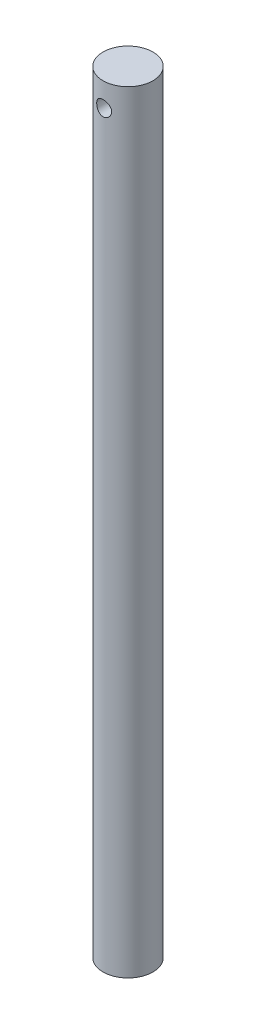
ISO-10303-21;
HEADER;
FILE_DESCRIPTION(('STEP AP214'),'2;1');
FILE_NAME('part.step','',(''),(''),'','','');
FILE_SCHEMA(('AUTOMOTIVE_DESIGN { 1 0 10303 214 1 1 1 1 }'));
ENDSEC;
DATA;
#1=APPLICATION_CONTEXT('core data for automotive mechanical design processes');
#2=APPLICATION_PROTOCOL_DEFINITION('international standard','automotive_design',2000,#1);
#3=PRODUCT_CONTEXT('',#1,'mechanical');
#4=PRODUCT('Part','Part','',(#3));
#5=PRODUCT_RELATED_PRODUCT_CATEGORY('part','',(#4));
#6=PRODUCT_DEFINITION_FORMATION('','',#4);
#7=PRODUCT_DEFINITION_CONTEXT('part definition',#1,'design');
#8=PRODUCT_DEFINITION('design','',#6,#7);
#9=PRODUCT_DEFINITION_SHAPE('','',#8);
#10=(LENGTH_UNIT() NAMED_UNIT(*) SI_UNIT(.MILLI.,.METRE.));
#11=(NAMED_UNIT(*) PLANE_ANGLE_UNIT() SI_UNIT($,.RADIAN.));
#12=(NAMED_UNIT(*) SI_UNIT($,.STERADIAN.) SOLID_ANGLE_UNIT());
#13=UNCERTAINTY_MEASURE_WITH_UNIT(LENGTH_MEASURE(1.E-05),#10,'distance_accuracy_value','');
#14=(GEOMETRIC_REPRESENTATION_CONTEXT(3) GLOBAL_UNCERTAINTY_ASSIGNED_CONTEXT((#13)) GLOBAL_UNIT_ASSIGNED_CONTEXT((#10,
#11,#12)) REPRESENTATION_CONTEXT('',''));
#15=CARTESIAN_POINT('',(0.,0.,0.));
#16=DIRECTION('',(0.,0.,1.));
#17=DIRECTION('',(1.,0.,0.));
#18=AXIS2_PLACEMENT_3D('',#15,#16,#17);
#19=CARTESIAN_POINT('',(0.,309.5,0.));
#20=DIRECTION('',(0.,-1.,0.));
#21=DIRECTION('',(0.,0.,-1.));
#22=AXIS2_PLACEMENT_3D('',#19,#20,#21);
#23=CYLINDRICAL_SURFACE('',#22,10.);
#24=CARTESIAN_POINT('',(0.,303.,-10.));
#25=CARTESIAN_POINT('',(-0.164577225506596,302.99999800503,-9.99999858501101));
#26=CARTESIAN_POINT('',(-0.329174636703054,302.986412272752,-9.99589831387907));
#27=CARTESIAN_POINT('',(-0.653576250609755,302.932557291556,-9.97994211187382));
#28=CARTESIAN_POINT('',(-0.813379008822833,302.892280083953,-9.96808386779384));
#29=CARTESIAN_POINT('',(-1.12346541550904,302.786507966179,-9.93791105003673));
#30=CARTESIAN_POINT('',(-1.27376272879073,302.721050260762,-9.91960600500851));
#31=CARTESIAN_POINT('',(-1.56124836210625,302.566927813888,-9.87844218475291));
#32=CARTESIAN_POINT('',(-1.69843493493933,302.478259985209,-9.85558280384133));
#33=CARTESIAN_POINT('',(-1.95974359436747,302.277551985055,-9.80701474385548));
#34=CARTESIAN_POINT('',(-2.08343614248865,302.164966748228,-9.78124767314073));
#35=CARTESIAN_POINT('',(-2.31049841846644,301.92078154018,-9.73011668420885));
#36=CARTESIAN_POINT('',(-2.41386472654879,301.78917837575,-9.70475283449003));
#37=CARTESIAN_POINT('',(-2.59960075447414,301.507058493925,-9.65668227987544));
#38=CARTESIAN_POINT('',(-2.68144618044426,301.356183078019,-9.6340481332775));
#39=CARTESIAN_POINT('',(-2.81842789549521,301.042021491539,-9.59487240788062));
#40=CARTESIAN_POINT('',(-2.87357059839946,300.878738312144,-9.57832936626621));
#41=CARTESIAN_POINT('',(-2.95403267365303,300.549219467739,-9.55381741676869));
#42=CARTESIAN_POINT('',(-2.98014392469354,300.383194512272,-9.54562138649067));
#43=CARTESIAN_POINT('',(-3.00427461229344,300.048933687567,-9.53805579499534));
#44=CARTESIAN_POINT('',(-3.00230085522157,299.880698363882,-9.53868409521142));
#45=CARTESIAN_POINT('',(-2.97093954399624,299.553232182783,-9.54849488135555));
#46=CARTESIAN_POINT('',(-2.94254410525371,299.393895499276,-9.55736777198281));
#47=CARTESIAN_POINT('',(-2.86074840854114,299.082360427453,-9.58216712457248));
#48=CARTESIAN_POINT('',(-2.80734568283284,298.930162745251,-9.598094282647));
#49=CARTESIAN_POINT('',(-2.67632053307366,298.634799300679,-9.63545466149945));
#50=CARTESIAN_POINT('',(-2.59837633869288,298.49178583209,-9.65696032231904));
#51=CARTESIAN_POINT('',(-2.42070445177369,298.22053595598,-9.70301974000128));
#52=CARTESIAN_POINT('',(-2.32097148005179,298.092303141172,-9.72757423493982));
#53=CARTESIAN_POINT('',(-2.09762581531095,297.848627618476,-9.77822022595874));
#54=CARTESIAN_POINT('',(-1.97318981493396,297.733942671941,-9.80433308620995));
#55=CARTESIAN_POINT('',(-1.70652651862794,297.526892031872,-9.85424488126517));
#56=CARTESIAN_POINT('',(-1.56429810372178,297.434527743171,-9.8780436703682));
#57=CARTESIAN_POINT('',(-1.26471007668562,297.274280155071,-9.92086320138941));
#58=CARTESIAN_POINT('',(-1.10725549949592,297.2065649675,-9.93985087336628));
#59=CARTESIAN_POINT('',(-0.782490831207058,297.098800819801,-9.97067043664444));
#60=CARTESIAN_POINT('',(-0.615183503179173,297.058744142935,-9.98250432373999));
#61=CARTESIAN_POINT('',(-0.281904485336665,297.008695644201,-9.99736729287077));
#62=CARTESIAN_POINT('',(-0.116100195202378,296.997676828397,-10.0006970083558));
#63=CARTESIAN_POINT('',(0.214999211646758,297.003138311424,-9.99905846483519));
#64=CARTESIAN_POINT('',(0.380294393381552,297.019614939303,-9.99409131355514));
#65=CARTESIAN_POINT('',(0.701807210619389,297.078769222223,-9.97661393974325));
#66=CARTESIAN_POINT('',(0.858145545228339,297.120846775162,-9.96427659598829));
#67=CARTESIAN_POINT('',(1.16150927790904,297.229286465556,-9.9334869568307));
#68=CARTESIAN_POINT('',(1.30853355405116,297.295651522076,-9.91503392642188));
#69=CARTESIAN_POINT('',(1.5928743789221,297.452506330962,-9.87339308702631));
#70=CARTESIAN_POINT('',(1.72988765239935,297.543518681896,-9.8501056165928));
#71=CARTESIAN_POINT('',(1.98704661596031,297.746449508106,-9.80146937528704));
#72=CARTESIAN_POINT('',(2.10718806471189,297.858373223775,-9.7761200886242));
#73=CARTESIAN_POINT('',(2.33171489102052,298.104774616739,-9.72506343738007));
#74=CARTESIAN_POINT('',(2.43536962463002,298.239923751544,-9.69937650065513));
#75=CARTESIAN_POINT('',(2.61857990144313,298.526255878027,-9.65153030477949));
#76=CARTESIAN_POINT('',(2.69813607658965,298.677438449116,-9.62937095313121));
#77=CARTESIAN_POINT('',(2.83034694254316,298.99106498251,-9.5913437922631));
#78=CARTESIAN_POINT('',(2.88312693874023,299.153452373076,-9.575446756735));
#79=CARTESIAN_POINT('',(2.96043461630307,299.485375937861,-9.55183188739737));
#80=CARTESIAN_POINT('',(2.98497197957849,299.654909641566,-9.54411125069387));
#81=CARTESIAN_POINT('',(3.0044396896993,299.988723036777,-9.53799944941558));
#82=CARTESIAN_POINT('',(3.00056110615887,300.152927302099,-9.53923294700395));
#83=CARTESIAN_POINT('',(2.9661501088861,300.478228206801,-9.54998802392189));
#84=CARTESIAN_POINT('',(2.93561876249407,300.639324970361,-9.55950927135902));
#85=CARTESIAN_POINT('',(2.84953777608685,300.951890798263,-9.58551527389243));
#86=CARTESIAN_POINT('',(2.79430351014246,301.103454574717,-9.60191209104934));
#87=CARTESIAN_POINT('',(2.66063014242145,301.395284877641,-9.63980557805266));
#88=CARTESIAN_POINT('',(2.5821865992572,301.535549235283,-9.66130322385081));
#89=CARTESIAN_POINT('',(2.40097527610173,301.806326233053,-9.70795352855339));
#90=CARTESIAN_POINT('',(2.29742552185994,301.93629752252,-9.73321080328581));
#91=CARTESIAN_POINT('',(2.07034869259554,302.177404996616,-9.78402640899067));
#92=CARTESIAN_POINT('',(1.94681643426897,302.288536278936,-9.80958481647543));
#93=CARTESIAN_POINT('',(1.67893152436652,302.49204682459,-9.85901873141573));
#94=CARTESIAN_POINT('',(1.53407577158122,302.583782893711,-9.88282319531421));
#95=CARTESIAN_POINT('',(1.23028274796706,302.741470339808,-9.92521360911553));
#96=CARTESIAN_POINT('',(1.07135210599791,302.807433776549,-9.94380199862114));
#97=CARTESIAN_POINT('',(0.761515425310563,302.905790551306,-9.97204349938619));
#98=CARTESIAN_POINT('',(0.611573923908467,302.941023345766,-9.9824405476214));
#99=CARTESIAN_POINT('',(0.307760390461558,302.988127050483,-9.9964188898898));
#100=CARTESIAN_POINT('',(0.15388901971628,303.00000186541,-10.0000013230948));
#101=CARTESIAN_POINT('',(0.,303.,-10.));
#102=B_SPLINE_CURVE_WITH_KNOTS('',3,(#24,#25,#26,#27,#28,#29,#30,#31,#32,#33,#34,#35,#36,#37,
#38,#39,#40,#41,#42,#43,#44,#45,#46,#47,#48,#49,#50,#51,#52,#53,#54,#55,#56,#57,#58,#59,#60,#61,
#62,#63,#64,#65,#66,#67,#68,#69,#70,#71,#72,#73,#74,#75,#76,#77,#78,#79,#80,#81,#82,#83,#84,#85,
#86,#87,#88,#89,#90,#91,#92,#93,#94,#95,#96,#97,#98,#99,#100,#101),.UNSPECIFIED.,.T.,.F.,(4,2,2,
2,2,2,2,2,2,2,2,2,2,2,2,2,2,2,2,2,2,2,2,2,2,2,2,2,2,2,2,2,2,2,2,2,2,2,4),(0.,0.493166407225214,
0.986479929691996,1.47906735260173,1.97172032882538,2.47711205896375,2.98258874577264,
3.49942962008215,4.01614629086449,4.51839378713193,5.02051956638178,5.50452033395345,
5.98856887315995,6.47924852894233,6.97004720317107,7.48134208096332,7.99266913062141,
8.50742093763375,9.02202907057615,9.51817618877089,10.0142570710065,10.4991349336465,
10.9840710918746,11.4802261140582,11.9765056400038,12.4908080064564,13.0050968850536,
13.5169562990251,14.0286401892057,14.5190031093855,15.0093463933232,15.4936008081456,
15.9779479511534,16.4799385136898,16.9820594980412,17.4988599232246,18.0154182319959,
18.4766338387004,18.9377723390687),.UNSPECIFIED.);
#103=CARTESIAN_POINT('',(0.,303.,-10.));
#104=VERTEX_POINT('',#103);
#105=EDGE_CURVE('E10',#104,#104,#102,.T.);
#106=ORIENTED_EDGE('',*,*,#105,.T.);
#107=EDGE_LOOP('',(#106));
#108=FACE_BOUND('',#107,.T.);
#109=CARTESIAN_POINT('',(3.,300.,9.53939201416946));
#110=CARTESIAN_POINT('',(2.99999795267528,299.835610904115,9.5393937145396));
#111=CARTESIAN_POINT('',(2.98644216334285,299.671201551712,9.54368780418137));
#112=CARTESIAN_POINT('',(2.93271688893498,299.347189500816,9.560331566058));
#113=CARTESIAN_POINT('',(2.89253851147156,299.187588426997,9.57268392986936));
#114=CARTESIAN_POINT('',(2.78705506539911,298.877930543457,9.60392204971265));
#115=CARTESIAN_POINT('',(2.72179178788488,298.727858340734,9.62279693406464));
#116=CARTESIAN_POINT('',(2.56812843835859,298.440756132009,9.66493865095134));
#117=CARTESIAN_POINT('',(2.47972490274105,298.303728082631,9.68820614082039));
#118=CARTESIAN_POINT('',(2.27929508283253,298.042267218845,9.73733724371531));
#119=CARTESIAN_POINT('',(2.16666414351613,297.918308204107,9.76325616623271));
#120=CARTESIAN_POINT('',(1.92227247515922,297.690724097355,9.81429723873513));
#121=CARTESIAN_POINT('',(1.79050929092225,297.5871016191,9.83941928595409));
#122=CARTESIAN_POINT('',(1.50822287558741,297.401074600333,9.88666429158777));
#123=CARTESIAN_POINT('',(1.35736804267165,297.319153151114,9.90871448684808));
#124=CARTESIAN_POINT('',(1.04324929073872,297.182025481914,9.94668871841369));
#125=CARTESIAN_POINT('',(0.879988056775836,297.126813500285,9.96261407578992));
#126=CARTESIAN_POINT('',(0.550647705261673,297.046239997819,9.98615292007178));
#127=CARTESIAN_POINT('',(0.384782797907614,297.020069744695,9.99399114738673));
#128=CARTESIAN_POINT('',(0.0508436474986363,296.995765350707,10.001264030027));
#129=CARTESIAN_POINT('',(-0.117230124100735,296.997625321196,10.0007004504217));
#130=CARTESIAN_POINT('',(-0.445142313200314,297.028785737086,9.99139207635305));
#131=CARTESIAN_POINT('',(-0.605072535282667,297.05721038762,9.98290840410476));
#132=CARTESIAN_POINT('',(-0.917778426885076,297.139262671989,9.95903044225231));
#133=CARTESIAN_POINT('',(-1.07055364264576,297.192891901886,9.94363571501341));
#134=CARTESIAN_POINT('',(-1.36669465270247,297.324424046837,9.90730441973756));
#135=CARTESIAN_POINT('',(-1.50993012938865,297.402602405614,9.88630539352772));
#136=CARTESIAN_POINT('',(-1.78152934756665,297.580795704857,9.84099281296777));
#137=CARTESIAN_POINT('',(-1.90988954974545,297.680815825929,9.81667847277943));
#138=CARTESIAN_POINT('',(-2.15332096305837,297.904395501501,9.76623100973852));
#139=CARTESIAN_POINT('',(-2.26768916079756,298.028713838051,9.74006390633503));
#140=CARTESIAN_POINT('',(-2.47415303080115,298.295020035789,9.68967959784414));
#141=CARTESIAN_POINT('',(-2.56624648967453,298.437009650811,9.66546258669242));
#142=CARTESIAN_POINT('',(-2.72627990669512,298.736478938472,9.62155806359712));
#143=CARTESIAN_POINT('',(-2.79397978469378,298.894094091617,9.6019162125849));
#144=CARTESIAN_POINT('',(-2.90166725750739,299.219214416779,9.5699278496379));
#145=CARTESIAN_POINT('',(-2.94166389279494,299.386716343035,9.5575789579664));
#146=CARTESIAN_POINT('',(-2.99149540565762,299.720164721502,9.54209699116239));
#147=CARTESIAN_POINT('',(-3.00239892760807,299.885936447794,9.53863757349917));
#148=CARTESIAN_POINT('',(-2.99671894465741,300.216945800013,9.54042384874812));
#149=CARTESIAN_POINT('',(-2.98013928742559,300.38218349746,9.54566832310786));
#150=CARTESIAN_POINT('',(-2.9209152714848,300.702976755943,9.56395117112153));
#151=CARTESIAN_POINT('',(-2.87895922862589,300.858672328527,9.57678353015601));
#152=CARTESIAN_POINT('',(-2.77097155495855,301.160803381629,9.6085828246183));
#153=CARTESIAN_POINT('',(-2.70493620685512,301.307237428281,9.62755070717977));
#154=CARTESIAN_POINT('',(-2.54863742393009,301.591034928144,9.67011670046268));
#155=CARTESIAN_POINT('',(-2.45777128345462,301.728049441972,9.69382542139644));
#156=CARTESIAN_POINT('',(-2.25510603200769,301.985276212362,9.74296411293927));
#157=CARTESIAN_POINT('',(-2.14330191069793,302.105484435226,9.76839449459993));
#158=CARTESIAN_POINT('',(-1.89691026498719,302.33036081163,9.8192726709633));
#159=CARTESIAN_POINT('',(-1.76162213171484,302.434271257974,9.84468490126012));
#160=CARTESIAN_POINT('',(-1.47492356918047,302.617933402055,9.89169703497298));
#161=CARTESIAN_POINT('',(-1.32351394108788,302.697686299563,9.91329712769433));
#162=CARTESIAN_POINT('',(-1.00987100941046,302.830000061137,9.95011940949915));
#163=CARTESIAN_POINT('',(-0.847729244075699,302.882764032318,9.96538906849931));
#164=CARTESIAN_POINT('',(-0.516339933009199,302.960121837781,9.98803959193653));
#165=CARTESIAN_POINT('',(-0.347094434709547,302.984723731897,9.9954227134176));
#166=CARTESIAN_POINT('',(-0.0133043077655057,303.004446088109,10.001330881628));
#167=CARTESIAN_POINT('',(0.151170358172395,303.000665390816,10.0001861022264));
#168=CARTESIAN_POINT('',(0.477038962328793,302.966356735002,9.98994528930073));
#169=CARTESIAN_POINT('',(0.638433074693044,302.935830293039,9.98084970660925));
#170=CARTESIAN_POINT('',(0.951871626082697,302.849576677201,9.95582336716653));
#171=CARTESIAN_POINT('',(1.10399785470276,302.794123638702,9.93996705801732));
#172=CARTESIAN_POINT('',(1.39686647550408,302.659836170986,9.903058860789));
#173=CARTESIAN_POINT('',(1.53760699210114,302.580997899428,9.88200611899893));
#174=CARTESIAN_POINT('',(1.80860378484111,302.39925308514,9.83607931656457));
#175=CARTESIAN_POINT('',(1.93838050015352,302.295657139998,9.81110453847119));
#176=CARTESIAN_POINT('',(2.17907514269187,302.068579223334,9.76047074424668));
#177=CARTESIAN_POINT('',(2.28998761920385,301.945091524204,9.73481153282159));
#178=CARTESIAN_POINT('',(2.49312538789095,301.677318443379,9.68481361262639));
#179=CARTESIAN_POINT('',(2.58469519515911,301.532522893219,9.66053705386971));
#180=CARTESIAN_POINT('',(2.74208627057551,301.228889651678,9.61705095017586));
#181=CARTESIAN_POINT('',(2.80791991114576,301.070058752798,9.59783897193912));
#182=CARTESIAN_POINT('',(2.90603885065898,300.760519136787,9.56855633435189));
#183=CARTESIAN_POINT('',(2.94117718022463,300.610782706138,9.5577230968104));
#184=CARTESIAN_POINT('',(2.98815637670288,300.307369555008,9.54314085194333));
#185=CARTESIAN_POINT('',(3.00000191412191,300.153693630709,9.53939042442861));
#186=CARTESIAN_POINT('',(3.,300.,9.53939201416946));
#187=B_SPLINE_CURVE_WITH_KNOTS('',3,(#109,#110,#111,#112,#113,#114,#115,#116,#117,#118,#119,
#120,#121,#122,#123,#124,#125,#126,#127,#128,#129,#130,#131,#132,#133,#134,#135,#136,#137,#138,
#139,#140,#141,#142,#143,#144,#145,#146,#147,#148,#149,#150,#151,#152,#153,#154,#155,#156,#157,
#158,#159,#160,#161,#162,#163,#164,#165,#166,#167,#168,#169,#170,#171,#172,#173,#174,#175,#176,
#177,#178,#179,#180,#181,#182,#183,#184,#185,#186),.UNSPECIFIED.,.T.,.F.,(4,2,2,2,2,2,2,2,2,2,2,
2,2,2,2,2,2,2,2,2,2,2,2,2,2,2,2,2,2,2,2,2,2,2,2,2,2,2,4),(0.,0.492600331831125,
0.985365283377987,1.47731282893238,1.96933405074021,2.47546300015968,2.98165695742543,
3.49831878547288,4.01486911175753,4.51664280299115,5.01831108202881,5.50400251981762,
5.98972471780752,6.48110418671354,6.97260033181663,7.48304294046559,7.99353624983725,
8.50892476494932,9.02414501262031,9.52016161585833,10.0161087821998,10.4991718988284,
10.9823096209678,11.4784146362399,11.9746385186306,12.4895901220642,13.0045161465361,
13.5155078363386,14.0263532464857,14.5175260782765,15.0086710610072,15.4945419374965,
15.9804926898796,16.4819925411419,16.9836370526499,17.500232793435,18.016579879331,
18.4772230772011,18.9377739007233),.UNSPECIFIED.);
#188=CARTESIAN_POINT('',(3.,300.,9.53939201416946));
#189=VERTEX_POINT('',#188);
#190=EDGE_CURVE('E45',#189,#189,#187,.T.);
#191=ORIENTED_EDGE('',*,*,#190,.T.);
#192=EDGE_LOOP('',(#191));
#193=FACE_BOUND('',#192,.T.);
#194=CARTESIAN_POINT('',(0.,309.5,0.));
#195=DIRECTION('',(0.,1.,0.));
#196=DIRECTION('',(0.,0.,1.));
#197=AXIS2_PLACEMENT_3D('',#194,#195,#196);
#198=CIRCLE('',#197,10.);
#199=CARTESIAN_POINT('',(0.,309.5,10.));
#200=VERTEX_POINT('',#199);
#201=EDGE_CURVE('E49',#200,#200,#198,.T.);
#202=ORIENTED_EDGE('',*,*,#201,.F.);
#203=EDGE_LOOP('',(#202));
#204=FACE_BOUND('',#203,.T.);
#205=CARTESIAN_POINT('',(0.,0.,0.));
#206=DIRECTION('',(0.,1.,0.));
#207=DIRECTION('',(0.,0.,1.));
#208=AXIS2_PLACEMENT_3D('',#205,#206,#207);
#209=CIRCLE('',#208,10.);
#210=CARTESIAN_POINT('',(0.,0.,10.));
#211=VERTEX_POINT('',#210);
#212=EDGE_CURVE('E53',#211,#211,#209,.T.);
#213=ORIENTED_EDGE('',*,*,#212,.T.);
#214=EDGE_LOOP('',(#213));
#215=FACE_BOUND('',#214,.T.);
#216=ADVANCED_FACE('F34',(#108,#193,#204,#215),#23,.T.);
#217=CARTESIAN_POINT('',(0.,309.5,0.));
#218=DIRECTION('',(0.,1.,0.));
#219=DIRECTION('',(0.,0.,1.));
#220=AXIS2_PLACEMENT_3D('',#217,#218,#219);
#221=PLANE('',#220);
#222=ORIENTED_EDGE('',*,*,#201,.T.);
#223=EDGE_LOOP('',(#222));
#224=FACE_BOUND('',#223,.T.);
#225=ADVANCED_FACE('F65',(#224),#221,.T.);
#226=CARTESIAN_POINT('',(0.,0.,0.));
#227=DIRECTION('',(0.,1.,0.));
#228=DIRECTION('',(0.,0.,1.));
#229=AXIS2_PLACEMENT_3D('',#226,#227,#228);
#230=PLANE('',#229);
#231=ORIENTED_EDGE('',*,*,#212,.F.);
#232=EDGE_LOOP('',(#231));
#233=FACE_BOUND('',#232,.T.);
#234=ADVANCED_FACE('F63',(#233),#230,.F.);
#235=CARTESIAN_POINT('',(0.,300.,-10.));
#236=DIRECTION('',(0.,0.,1.));
#237=DIRECTION('',(1.,0.,0.));
#238=AXIS2_PLACEMENT_3D('',#235,#236,#237);
#239=CYLINDRICAL_SURFACE('',#238,3.);
#240=ORIENTED_EDGE('',*,*,#190,.F.);
#241=EDGE_LOOP('',(#240));
#242=FACE_BOUND('',#241,.T.);
#243=ORIENTED_EDGE('',*,*,#105,.F.);
#244=EDGE_LOOP('',(#243));
#245=FACE_BOUND('',#244,.T.);
#246=ADVANCED_FACE('F59',(#242,#245),#239,.F.);
#247=CLOSED_SHELL('',(#216,#225,#234,#246));
#248=MANIFOLD_SOLID_BREP('B2',#247);
#249=ADVANCED_BREP_SHAPE_REPRESENTATION('',(#18,#248),#14);
#250=SHAPE_DEFINITION_REPRESENTATION(#9,#249);
ENDSEC;
END-ISO-10303-21;
